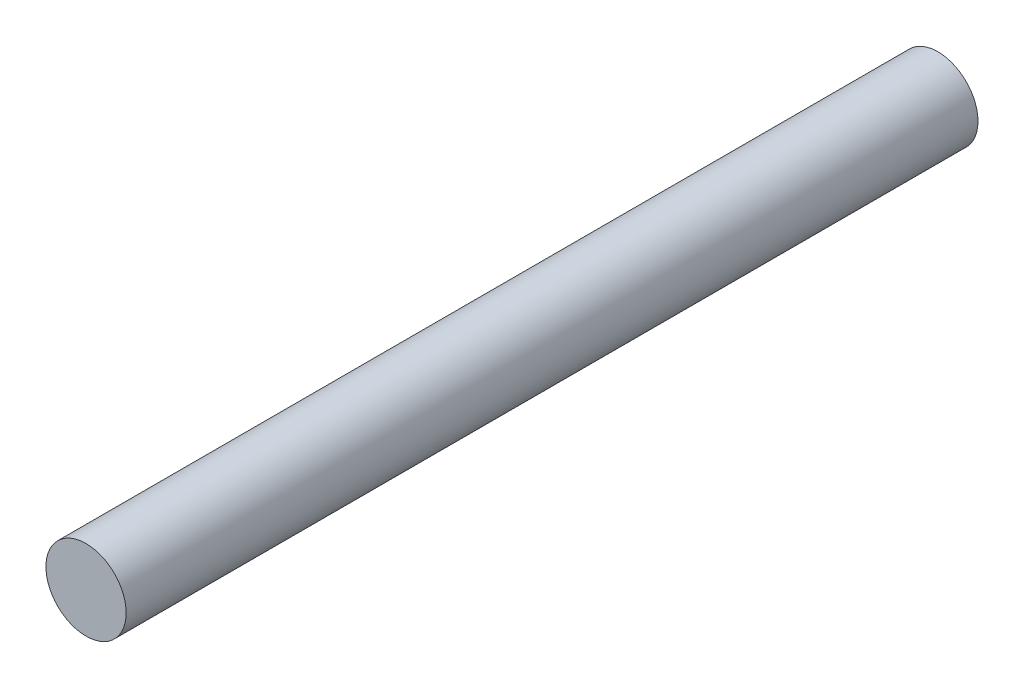
ISO-10303-21;
HEADER;
FILE_DESCRIPTION(('STEP AP214'),'2;1');
FILE_NAME('part.step','',(''),(''),'','','');
FILE_SCHEMA(('AUTOMOTIVE_DESIGN { 1 0 10303 214 1 1 1 1 }'));
ENDSEC;
DATA;
#1=APPLICATION_CONTEXT('core data for automotive mechanical design processes');
#2=APPLICATION_PROTOCOL_DEFINITION('international standard','automotive_design',2000,#1);
#3=PRODUCT_CONTEXT('',#1,'mechanical');
#4=PRODUCT('Part','Part','',(#3));
#5=PRODUCT_RELATED_PRODUCT_CATEGORY('part','',(#4));
#6=PRODUCT_DEFINITION_FORMATION('','',#4);
#7=PRODUCT_DEFINITION_CONTEXT('part definition',#1,'design');
#8=PRODUCT_DEFINITION('design','',#6,#7);
#9=PRODUCT_DEFINITION_SHAPE('','',#8);
#10=(LENGTH_UNIT() NAMED_UNIT(*) SI_UNIT(.MILLI.,.METRE.));
#11=(NAMED_UNIT(*) PLANE_ANGLE_UNIT() SI_UNIT($,.RADIAN.));
#12=(NAMED_UNIT(*) SI_UNIT($,.STERADIAN.) SOLID_ANGLE_UNIT());
#13=UNCERTAINTY_MEASURE_WITH_UNIT(LENGTH_MEASURE(1.E-05),#10,'distance_accuracy_value','');
#14=(GEOMETRIC_REPRESENTATION_CONTEXT(3) GLOBAL_UNCERTAINTY_ASSIGNED_CONTEXT((#13)) GLOBAL_UNIT_ASSIGNED_CONTEXT((#10,
#11,#12)) REPRESENTATION_CONTEXT('',''));
#15=CARTESIAN_POINT('',(0.,0.,0.));
#16=DIRECTION('',(0.,0.,1.));
#17=DIRECTION('',(1.,0.,0.));
#18=AXIS2_PLACEMENT_3D('',#15,#16,#17);
#19=CARTESIAN_POINT('',(0.,0.,86.));
#20=DIRECTION('',(0.,0.,-1.));
#21=DIRECTION('',(-1.,0.,0.));
#22=AXIS2_PLACEMENT_3D('',#19,#20,#21);
#23=CYLINDRICAL_SURFACE('',#22,4.05);
#24=CARTESIAN_POINT('',(0.,0.,86.));
#25=DIRECTION('',(0.,0.,1.));
#26=DIRECTION('',(1.,0.,0.));
#27=AXIS2_PLACEMENT_3D('',#24,#25,#26);
#28=CIRCLE('',#27,4.05);
#29=CARTESIAN_POINT('',(4.05,0.,86.));
#30=VERTEX_POINT('',#29);
#31=EDGE_CURVE('E10',#30,#30,#28,.T.);
#32=ORIENTED_EDGE('',*,*,#31,.F.);
#33=EDGE_LOOP('',(#32));
#34=FACE_BOUND('',#33,.T.);
#35=CARTESIAN_POINT('',(0.,0.,0.));
#36=DIRECTION('',(0.,0.,1.));
#37=DIRECTION('',(1.,0.,0.));
#38=AXIS2_PLACEMENT_3D('',#35,#36,#37);
#39=CIRCLE('',#38,4.05);
#40=CARTESIAN_POINT('',(4.05,0.,0.));
#41=VERTEX_POINT('',#40);
#42=EDGE_CURVE('E34',#41,#41,#39,.T.);
#43=ORIENTED_EDGE('',*,*,#42,.T.);
#44=EDGE_LOOP('',(#43));
#45=FACE_BOUND('',#44,.T.);
#46=ADVANCED_FACE('F31',(#34,#45),#23,.T.);
#47=CARTESIAN_POINT('',(0.,0.,86.));
#48=DIRECTION('',(0.,0.,1.));
#49=DIRECTION('',(1.,0.,0.));
#50=AXIS2_PLACEMENT_3D('',#47,#48,#49);
#51=PLANE('',#50);
#52=ORIENTED_EDGE('',*,*,#31,.T.);
#53=EDGE_LOOP('',(#52));
#54=FACE_BOUND('',#53,.T.);
#55=ADVANCED_FACE('F46',(#54),#51,.T.);
#56=CARTESIAN_POINT('',(0.,0.,0.));
#57=DIRECTION('',(0.,0.,1.));
#58=DIRECTION('',(1.,0.,0.));
#59=AXIS2_PLACEMENT_3D('',#56,#57,#58);
#60=PLANE('',#59);
#61=ORIENTED_EDGE('',*,*,#42,.F.);
#62=EDGE_LOOP('',(#61));
#63=FACE_BOUND('',#62,.T.);
#64=ADVANCED_FACE('F44',(#63),#60,.F.);
#65=CLOSED_SHELL('',(#46,#55,#64));
#66=MANIFOLD_SOLID_BREP('B2',#65);
#67=ADVANCED_BREP_SHAPE_REPRESENTATION('',(#18,#66),#14);
#68=SHAPE_DEFINITION_REPRESENTATION(#9,#67);
ENDSEC;
END-ISO-10303-21;
